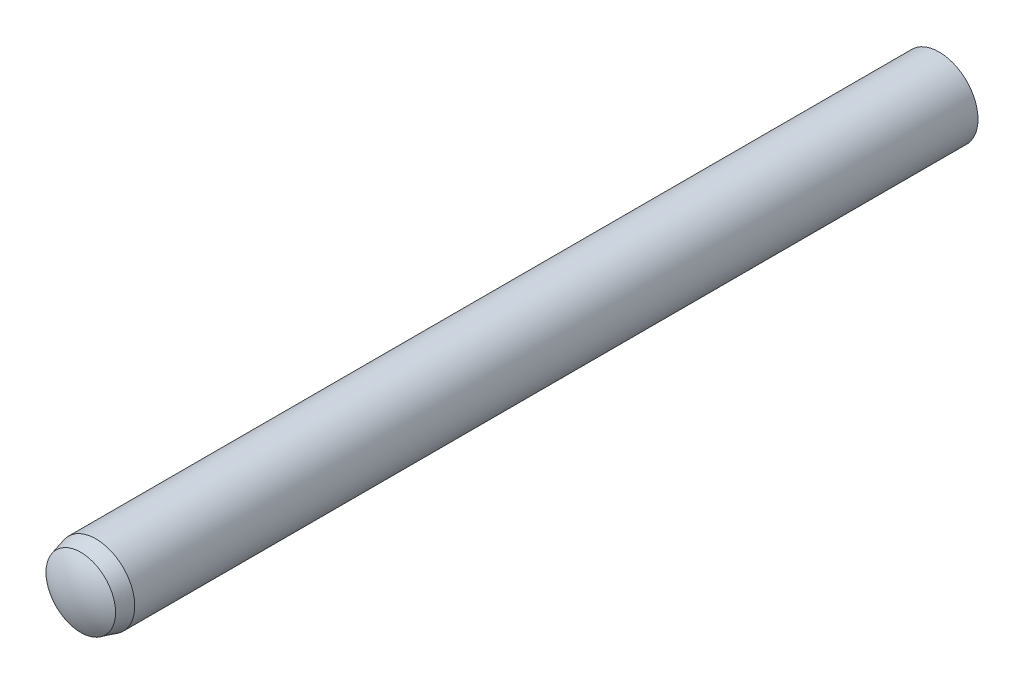
ISO-10303-21;
HEADER;
FILE_DESCRIPTION(('STEP AP214'),'2;1');
FILE_NAME('part.step','',(''),(''),'','','');
FILE_SCHEMA(('AUTOMOTIVE_DESIGN { 1 0 10303 214 1 1 1 1 }'));
ENDSEC;
DATA;
#1=APPLICATION_CONTEXT('core data for automotive mechanical design processes');
#2=APPLICATION_PROTOCOL_DEFINITION('international standard','automotive_design',2000,#1);
#3=PRODUCT_CONTEXT('',#1,'mechanical');
#4=PRODUCT('Part','Part','',(#3));
#5=PRODUCT_RELATED_PRODUCT_CATEGORY('part','',(#4));
#6=PRODUCT_DEFINITION_FORMATION('','',#4);
#7=PRODUCT_DEFINITION_CONTEXT('part definition',#1,'design');
#8=PRODUCT_DEFINITION('design','',#6,#7);
#9=PRODUCT_DEFINITION_SHAPE('','',#8);
#10=(LENGTH_UNIT() NAMED_UNIT(*) SI_UNIT(.MILLI.,.METRE.));
#11=(NAMED_UNIT(*) PLANE_ANGLE_UNIT() SI_UNIT($,.RADIAN.));
#12=(NAMED_UNIT(*) SI_UNIT($,.STERADIAN.) SOLID_ANGLE_UNIT());
#13=UNCERTAINTY_MEASURE_WITH_UNIT(LENGTH_MEASURE(1.E-05),#10,'distance_accuracy_value','');
#14=(GEOMETRIC_REPRESENTATION_CONTEXT(3) GLOBAL_UNCERTAINTY_ASSIGNED_CONTEXT((#13)) GLOBAL_UNIT_ASSIGNED_CONTEXT((#10,
#11,#12)) REPRESENTATION_CONTEXT('',''));
#15=CARTESIAN_POINT('',(0.,0.,0.));
#16=DIRECTION('',(0.,0.,1.));
#17=DIRECTION('',(1.,0.,0.));
#18=AXIS2_PLACEMENT_3D('',#15,#16,#17);
#19=CARTESIAN_POINT('',(0.,0.,-14.275));
#20=DIRECTION('',(0.,0.,1.));
#21=DIRECTION('',(0.,1.,0.));
#22=AXIS2_PLACEMENT_3D('',#19,#20,#21);
#23=SPHERICAL_SURFACE('',#22,2.72499999999999);
#24=CARTESIAN_POINT('',(0.,0.,-16.55));
#25=DIRECTION('',(0.,0.,1.));
#26=DIRECTION('',(0.,-1.,0.));
#27=AXIS2_PLACEMENT_3D('',#24,#25,#26);
#28=CIRCLE('',#27,1.49999999999999);
#29=CARTESIAN_POINT('',(0.,-1.49999999999999,-16.55));
#30=VERTEX_POINT('',#29);
#31=EDGE_CURVE('E10',#30,#30,#28,.T.);
#32=ORIENTED_EDGE('',*,*,#31,.F.);
#33=EDGE_LOOP('',(#32));
#34=FACE_BOUND('',#33,.T.);
#35=ADVANCED_FACE('F30',(#34),#23,.T.);
#36=CARTESIAN_POINT('',(0.,0.,17.));
#37=DIRECTION('',(0.,0.,1.));
#38=DIRECTION('',(0.,-1.,0.));
#39=AXIS2_PLACEMENT_3D('',#36,#37,#38);
#40=CYLINDRICAL_SURFACE('',#39,1.5);
#41=CARTESIAN_POINT('',(0.,0.,16.025));
#42=DIRECTION('',(0.,0.,1.));
#43=DIRECTION('',(0.,-1.,0.));
#44=AXIS2_PLACEMENT_3D('',#41,#42,#43);
#45=CIRCLE('',#44,1.5);
#46=CARTESIAN_POINT('',(0.,-1.5,16.025));
#47=VERTEX_POINT('',#46);
#48=EDGE_CURVE('E36',#47,#47,#45,.T.);
#49=ORIENTED_EDGE('',*,*,#48,.F.);
#50=EDGE_LOOP('',(#49));
#51=FACE_BOUND('',#50,.T.);
#52=ORIENTED_EDGE('',*,*,#31,.T.);
#53=EDGE_LOOP('',(#52));
#54=FACE_BOUND('',#53,.T.);
#55=ADVANCED_FACE('F51',(#51,#54),#40,.T.);
#56=CARTESIAN_POINT('',(0.,0.,16.025));
#57=DIRECTION('',(0.,0.,-1.));
#58=DIRECTION('',(0.,1.,0.));
#59=AXIS2_PLACEMENT_3D('',#56,#57,#58);
#60=CONICAL_SURFACE('',#59,1.5,0.261799387799149);
#61=CARTESIAN_POINT('',(0.,0.,16.61));
#62=DIRECTION('',(0.,0.,1.));
#63=DIRECTION('',(0.,-1.,0.));
#64=AXIS2_PLACEMENT_3D('',#61,#62,#63);
#65=CIRCLE('',#64,1.34324972242779);
#66=CARTESIAN_POINT('',(0.,-1.34324972242779,16.61));
#67=VERTEX_POINT('',#66);
#68=EDGE_CURVE('E40',#67,#67,#65,.T.);
#69=ORIENTED_EDGE('',*,*,#68,.F.);
#70=EDGE_LOOP('',(#69));
#71=FACE_BOUND('',#70,.T.);
#72=ORIENTED_EDGE('',*,*,#48,.T.);
#73=EDGE_LOOP('',(#72));
#74=FACE_BOUND('',#73,.T.);
#75=ADVANCED_FACE('F49',(#71,#74),#60,.T.);
#76=CARTESIAN_POINT('',(0.,0.,14.491769465638));
#77=DIRECTION('',(0.,0.,1.));
#78=DIRECTION('',(0.,1.,0.));
#79=AXIS2_PLACEMENT_3D('',#76,#77,#78);
#80=SPHERICAL_SURFACE('',#79,2.50823053436197);
#81=ORIENTED_EDGE('',*,*,#68,.T.);
#82=EDGE_LOOP('',(#81));
#83=FACE_BOUND('',#82,.T.);
#84=ADVANCED_FACE('F47',(#83),#80,.T.);
#85=CLOSED_SHELL('',(#35,#55,#75,#84));
#86=MANIFOLD_SOLID_BREP('B2',#85);
#87=ADVANCED_BREP_SHAPE_REPRESENTATION('',(#18,#86),#14);
#88=SHAPE_DEFINITION_REPRESENTATION(#9,#87);
ENDSEC;
END-ISO-10303-21;
